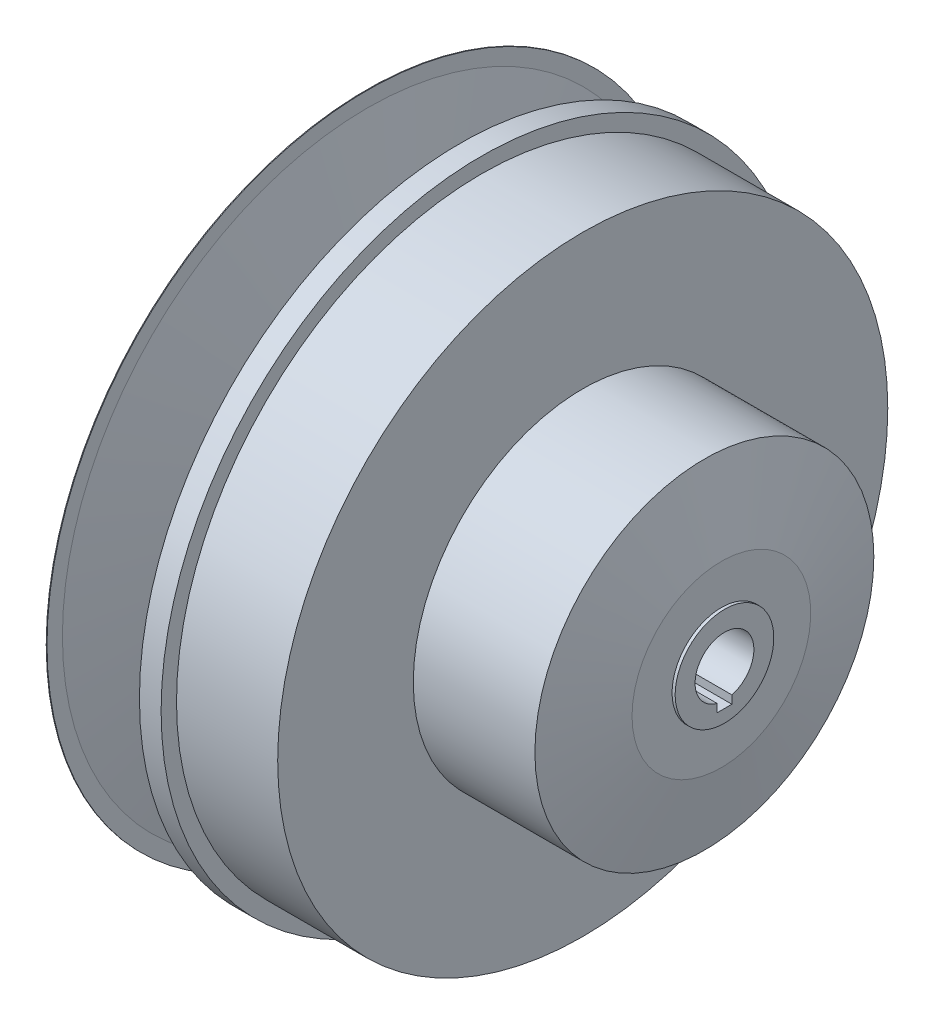
ISO-10303-21;
HEADER;
FILE_DESCRIPTION(('STEP AP214'),'2;1');
FILE_NAME('part.step','',(''),(''),'','','');
FILE_SCHEMA(('AUTOMOTIVE_DESIGN { 1 0 10303 214 1 1 1 1 }'));
ENDSEC;
DATA;
#1=APPLICATION_CONTEXT('core data for automotive mechanical design processes');
#2=APPLICATION_PROTOCOL_DEFINITION('international standard','automotive_design',2000,#1);
#3=PRODUCT_CONTEXT('',#1,'mechanical');
#4=PRODUCT('Part','Part','',(#3));
#5=PRODUCT_RELATED_PRODUCT_CATEGORY('part','',(#4));
#6=PRODUCT_DEFINITION_FORMATION('','',#4);
#7=PRODUCT_DEFINITION_CONTEXT('part definition',#1,'design');
#8=PRODUCT_DEFINITION('design','',#6,#7);
#9=PRODUCT_DEFINITION_SHAPE('','',#8);
#10=(LENGTH_UNIT() NAMED_UNIT(*) SI_UNIT(.MILLI.,.METRE.));
#11=(NAMED_UNIT(*) PLANE_ANGLE_UNIT() SI_UNIT($,.RADIAN.));
#12=(NAMED_UNIT(*) SI_UNIT($,.STERADIAN.) SOLID_ANGLE_UNIT());
#13=UNCERTAINTY_MEASURE_WITH_UNIT(LENGTH_MEASURE(1.E-05),#10,'distance_accuracy_value','');
#14=(GEOMETRIC_REPRESENTATION_CONTEXT(3) GLOBAL_UNCERTAINTY_ASSIGNED_CONTEXT((#13)) GLOBAL_UNIT_ASSIGNED_CONTEXT((#10,
#11,#12)) REPRESENTATION_CONTEXT('',''));
#15=CARTESIAN_POINT('',(0.,0.,0.));
#16=DIRECTION('',(0.,0.,1.));
#17=DIRECTION('',(1.,0.,0.));
#18=AXIS2_PLACEMENT_3D('',#15,#16,#17);
#19=CARTESIAN_POINT('',(-162.990125158944,0.,0.));
#20=DIRECTION('',(1.,0.,0.));
#21=DIRECTION('',(0.,0.,-1.));
#22=AXIS2_PLACEMENT_3D('',#19,#20,#21);
#23=PLANE('',#22);
#24=CARTESIAN_POINT('',(-162.990125158944,0.,0.));
#25=DIRECTION('',(-1.,0.,0.));
#26=DIRECTION('',(0.,0.,1.));
#27=AXIS2_PLACEMENT_3D('',#24,#25,#26);
#28=CIRCLE('',#27,15.125);
#29=CARTESIAN_POINT('',(-162.990125158944,0.,15.125));
#30=VERTEX_POINT('',#29);
#31=EDGE_CURVE('E96',#30,#30,#28,.T.);
#32=ORIENTED_EDGE('',*,*,#31,.F.);
#33=EDGE_LOOP('',(#32));
#34=FACE_BOUND('',#33,.T.);
#35=CARTESIAN_POINT('',(-162.990125158944,0.,0.));
#36=DIRECTION('',(-1.,0.,0.));
#37=DIRECTION('',(0.,0.,1.));
#38=AXIS2_PLACEMENT_3D('',#35,#36,#37);
#39=CIRCLE('',#38,16.125);
#40=CARTESIAN_POINT('',(-162.990125158944,0.,16.125));
#41=VERTEX_POINT('',#40);
#42=EDGE_CURVE('E11',#41,#41,#39,.T.);
#43=ORIENTED_EDGE('',*,*,#42,.T.);
#44=EDGE_LOOP('',(#43));
#45=FACE_BOUND('',#44,.T.);
#46=ADVANCED_FACE('F33',(#34,#45),#23,.F.);
#47=CARTESIAN_POINT('',(-162.990125158944,0.,0.));
#48=DIRECTION('',(-1.,0.,0.));
#49=DIRECTION('',(0.,0.,1.));
#50=AXIS2_PLACEMENT_3D('',#47,#48,#49);
#51=CYLINDRICAL_SURFACE('',#50,16.125);
#52=ORIENTED_EDGE('',*,*,#42,.F.);
#53=EDGE_LOOP('',(#52));
#54=FACE_BOUND('',#53,.T.);
#55=CARTESIAN_POINT('',(-163.990125158944,0.,0.));
#56=DIRECTION('',(-1.,0.,0.));
#57=DIRECTION('',(0.,0.,1.));
#58=AXIS2_PLACEMENT_3D('',#55,#56,#57);
#59=CIRCLE('',#58,16.125);
#60=CARTESIAN_POINT('',(-163.990125158944,0.,16.125));
#61=VERTEX_POINT('',#60);
#62=EDGE_CURVE('E40',#61,#61,#59,.T.);
#63=ORIENTED_EDGE('',*,*,#62,.T.);
#64=EDGE_LOOP('',(#63));
#65=FACE_BOUND('',#64,.T.);
#66=ADVANCED_FACE('F168',(#54,#65),#51,.F.);
#67=CARTESIAN_POINT('',(-163.990125158944,16.125,0.));
#68=DIRECTION('',(1.,0.,0.));
#69=DIRECTION('',(0.,0.,-1.));
#70=AXIS2_PLACEMENT_3D('',#67,#68,#69);
#71=PLANE('',#70);
#72=ORIENTED_EDGE('',*,*,#62,.F.);
#73=EDGE_LOOP('',(#72));
#74=FACE_BOUND('',#73,.T.);
#75=CARTESIAN_POINT('',(-163.990125158944,0.,0.));
#76=DIRECTION('',(-1.,0.,0.));
#77=DIRECTION('',(0.,0.,1.));
#78=AXIS2_PLACEMENT_3D('',#75,#76,#77);
#79=CIRCLE('',#78,37.7414540088167);
#80=CARTESIAN_POINT('',(-163.990125158944,0.,37.7414540088167));
#81=VERTEX_POINT('',#80);
#82=EDGE_CURVE('E163',#81,#81,#79,.T.);
#83=ORIENTED_EDGE('',*,*,#82,.T.);
#84=EDGE_LOOP('',(#83));
#85=FACE_BOUND('',#84,.T.);
#86=ADVANCED_FACE('F170',(#74,#85),#71,.F.);
#87=CARTESIAN_POINT('',(-162.990125158944,0.,0.));
#88=DIRECTION('',(-1.,0.,0.));
#89=DIRECTION('',(0.,0.,1.));
#90=AXIS2_PLACEMENT_3D('',#87,#88,#89);
#91=CYLINDRICAL_SURFACE('',#90,37.7414540088167);
#92=ORIENTED_EDGE('',*,*,#82,.F.);
#93=EDGE_LOOP('',(#92));
#94=FACE_BOUND('',#93,.T.);
#95=CARTESIAN_POINT('',(-160.123125158944,0.,0.));
#96=DIRECTION('',(-1.,0.,0.));
#97=DIRECTION('',(0.,0.,1.));
#98=AXIS2_PLACEMENT_3D('',#95,#96,#97);
#99=CIRCLE('',#98,37.7414540088167);
#100=CARTESIAN_POINT('',(-160.123125158944,0.,37.7414540088167));
#101=VERTEX_POINT('',#100);
#102=EDGE_CURVE('E160',#101,#101,#99,.T.);
#103=ORIENTED_EDGE('',*,*,#102,.T.);
#104=EDGE_LOOP('',(#103));
#105=FACE_BOUND('',#104,.T.);
#106=ADVANCED_FACE('F173',(#94,#105),#91,.T.);
#107=CARTESIAN_POINT('',(-160.123125158944,37.7414540088167,0.));
#108=DIRECTION('',(1.,0.,0.));
#109=DIRECTION('',(0.,0.,-1.));
#110=AXIS2_PLACEMENT_3D('',#107,#108,#109);
#111=PLANE('',#110);
#112=ORIENTED_EDGE('',*,*,#102,.F.);
#113=EDGE_LOOP('',(#112));
#114=FACE_BOUND('',#113,.T.);
#115=CARTESIAN_POINT('',(-160.123125158944,0.,0.));
#116=DIRECTION('',(-1.,0.,0.));
#117=DIRECTION('',(0.,0.,1.));
#118=AXIS2_PLACEMENT_3D('',#115,#116,#117);
#119=CIRCLE('',#118,99.);
#120=CARTESIAN_POINT('',(-160.123125158944,0.,99.));
#121=VERTEX_POINT('',#120);
#122=EDGE_CURVE('E157',#121,#121,#119,.T.);
#123=ORIENTED_EDGE('',*,*,#122,.T.);
#124=EDGE_LOOP('',(#123));
#125=FACE_BOUND('',#124,.T.);
#126=ADVANCED_FACE('F179',(#114,#125),#111,.F.);
#127=CARTESIAN_POINT('',(-162.990125158944,0.,0.));
#128=DIRECTION('',(-1.,0.,0.));
#129=DIRECTION('',(0.,0.,1.));
#130=AXIS2_PLACEMENT_3D('',#127,#128,#129);
#131=CYLINDRICAL_SURFACE('',#130,99.);
#132=ORIENTED_EDGE('',*,*,#122,.F.);
#133=EDGE_LOOP('',(#132));
#134=FACE_BOUND('',#133,.T.);
#135=CARTESIAN_POINT('',(-159.313606376247,0.,0.));
#136=DIRECTION('',(-1.,0.,0.));
#137=DIRECTION('',(0.,0.,1.));
#138=AXIS2_PLACEMENT_3D('',#135,#136,#137);
#139=CIRCLE('',#138,99.);
#140=CARTESIAN_POINT('',(-159.313606376247,0.,99.));
#141=VERTEX_POINT('',#140);
#142=EDGE_CURVE('E154',#141,#141,#139,.T.);
#143=ORIENTED_EDGE('',*,*,#142,.T.);
#144=EDGE_LOOP('',(#143));
#145=FACE_BOUND('',#144,.T.);
#146=ADVANCED_FACE('F185',(#134,#145),#131,.T.);
#147=CARTESIAN_POINT('',(-159.313606376247,104.,0.));
#148=DIRECTION('',(1.,0.,0.));
#149=DIRECTION('',(0.,0.,-1.));
#150=AXIS2_PLACEMENT_3D('',#147,#148,#149);
#151=PLANE('',#150);
#152=ORIENTED_EDGE('',*,*,#142,.F.);
#153=EDGE_LOOP('',(#152));
#154=FACE_BOUND('',#153,.T.);
#155=CARTESIAN_POINT('',(-159.313606376247,0.,0.));
#156=DIRECTION('',(-1.,0.,0.));
#157=DIRECTION('',(0.,0.,1.));
#158=AXIS2_PLACEMENT_3D('',#155,#156,#157);
#159=CIRCLE('',#158,104.);
#160=CARTESIAN_POINT('',(-159.313606376247,0.,104.));
#161=VERTEX_POINT('',#160);
#162=EDGE_CURVE('E151',#161,#161,#159,.T.);
#163=ORIENTED_EDGE('',*,*,#162,.T.);
#164=EDGE_LOOP('',(#163));
#165=FACE_BOUND('',#164,.T.);
#166=ADVANCED_FACE('F191',(#154,#165),#151,.F.);
#167=CARTESIAN_POINT('',(-162.990125158944,0.,0.));
#168=DIRECTION('',(-1.,0.,0.));
#169=DIRECTION('',(0.,0.,1.));
#170=AXIS2_PLACEMENT_3D('',#167,#168,#169);
#171=CYLINDRICAL_SURFACE('',#170,104.);
#172=ORIENTED_EDGE('',*,*,#162,.F.);
#173=EDGE_LOOP('',(#172));
#174=FACE_BOUND('',#173,.T.);
#175=CARTESIAN_POINT('',(-159.063606376247,0.,0.));
#176=DIRECTION('',(-1.,0.,0.));
#177=DIRECTION('',(0.,0.,1.));
#178=AXIS2_PLACEMENT_3D('',#175,#176,#177);
#179=CIRCLE('',#178,104.);
#180=CARTESIAN_POINT('',(-159.063606376247,0.,104.));
#181=VERTEX_POINT('',#180);
#182=EDGE_CURVE('E148',#181,#181,#179,.T.);
#183=ORIENTED_EDGE('',*,*,#182,.T.);
#184=EDGE_LOOP('',(#183));
#185=FACE_BOUND('',#184,.T.);
#186=ADVANCED_FACE('F197',(#174,#185),#171,.T.);
#187=CARTESIAN_POINT('',(-159.063606376247,99.,0.));
#188=DIRECTION('',(-1.,0.,0.));
#189=DIRECTION('',(0.,0.,1.));
#190=AXIS2_PLACEMENT_3D('',#187,#188,#189);
#191=PLANE('',#190);
#192=ORIENTED_EDGE('',*,*,#182,.F.);
#193=EDGE_LOOP('',(#192));
#194=FACE_BOUND('',#193,.T.);
#195=CARTESIAN_POINT('',(-159.063606376247,0.,0.));
#196=DIRECTION('',(-1.,0.,0.));
#197=DIRECTION('',(0.,0.,1.));
#198=AXIS2_PLACEMENT_3D('',#195,#196,#197);
#199=CIRCLE('',#198,99.);
#200=CARTESIAN_POINT('',(-159.063606376247,0.,99.));
#201=VERTEX_POINT('',#200);
#202=EDGE_CURVE('E145',#201,#201,#199,.T.);
#203=ORIENTED_EDGE('',*,*,#202,.T.);
#204=EDGE_LOOP('',(#203));
#205=FACE_BOUND('',#204,.T.);
#206=ADVANCED_FACE('F203',(#194,#205),#191,.F.);
#207=CARTESIAN_POINT('',(-148.352353258036,0.,0.));
#208=DIRECTION('',(-1.,0.,0.));
#209=DIRECTION('',(0.,0.,1.));
#210=AXIS2_PLACEMENT_3D('',#207,#208,#209);
#211=CONICAL_SURFACE('',#210,37.1899643021721,1.3992073118687);
#212=ORIENTED_EDGE('',*,*,#202,.F.);
#213=EDGE_LOOP('',(#212));
#214=FACE_BOUND('',#213,.T.);
#215=CARTESIAN_POINT('',(-148.352353258036,0.,0.));
#216=DIRECTION('',(-1.,0.,0.));
#217=DIRECTION('',(0.,0.,1.));
#218=AXIS2_PLACEMENT_3D('',#215,#216,#217);
#219=CIRCLE('',#218,37.1899643021721);
#220=CARTESIAN_POINT('',(-148.352353258036,0.,37.1899643021721));
#221=VERTEX_POINT('',#220);
#222=EDGE_CURVE('E142',#221,#221,#219,.T.);
#223=ORIENTED_EDGE('',*,*,#222,.T.);
#224=EDGE_LOOP('',(#223));
#225=FACE_BOUND('',#224,.T.);
#226=ADVANCED_FACE('F209',(#214,#225),#211,.T.);
#227=CARTESIAN_POINT('',(-148.352353258036,37.1899643021721,0.));
#228=DIRECTION('',(-1.,0.,0.));
#229=DIRECTION('',(0.,0.,1.));
#230=AXIS2_PLACEMENT_3D('',#227,#228,#229);
#231=PLANE('',#230);
#232=ORIENTED_EDGE('',*,*,#222,.F.);
#233=EDGE_LOOP('',(#232));
#234=FACE_BOUND('',#233,.T.);
#235=CARTESIAN_POINT('',(-148.352353258036,0.,0.));
#236=DIRECTION('',(-1.,0.,0.));
#237=DIRECTION('',(0.,0.,1.));
#238=AXIS2_PLACEMENT_3D('',#235,#236,#237);
#239=CIRCLE('',#238,29.1899643021721);
#240=CARTESIAN_POINT('',(-148.352353258036,0.,29.1899643021721));
#241=VERTEX_POINT('',#240);
#242=EDGE_CURVE('E139',#241,#241,#239,.T.);
#243=ORIENTED_EDGE('',*,*,#242,.T.);
#244=EDGE_LOOP('',(#243));
#245=FACE_BOUND('',#244,.T.);
#246=ADVANCED_FACE('F215',(#234,#245),#231,.F.);
#247=CARTESIAN_POINT('',(-162.990125158944,0.,0.));
#248=DIRECTION('',(-1.,0.,0.));
#249=DIRECTION('',(0.,0.,1.));
#250=AXIS2_PLACEMENT_3D('',#247,#248,#249);
#251=CYLINDRICAL_SURFACE('',#250,29.1899643021721);
#252=ORIENTED_EDGE('',*,*,#242,.F.);
#253=EDGE_LOOP('',(#252));
#254=FACE_BOUND('',#253,.T.);
#255=CARTESIAN_POINT('',(-145.011235330102,0.,0.));
#256=DIRECTION('',(-1.,0.,0.));
#257=DIRECTION('',(0.,0.,1.));
#258=AXIS2_PLACEMENT_3D('',#255,#256,#257);
#259=CIRCLE('',#258,29.1899643021721);
#260=CARTESIAN_POINT('',(-145.011235330102,0.,29.1899643021721));
#261=VERTEX_POINT('',#260);
#262=EDGE_CURVE('E136',#261,#261,#259,.T.);
#263=ORIENTED_EDGE('',*,*,#262,.T.);
#264=EDGE_LOOP('',(#263));
#265=FACE_BOUND('',#264,.T.);
#266=ADVANCED_FACE('F221',(#254,#265),#251,.T.);
#267=CARTESIAN_POINT('',(-145.011235330102,29.1899643021721,0.));
#268=DIRECTION('',(1.,0.,0.));
#269=DIRECTION('',(0.,0.,-1.));
#270=AXIS2_PLACEMENT_3D('',#267,#268,#269);
#271=PLANE('',#270);
#272=ORIENTED_EDGE('',*,*,#262,.F.);
#273=EDGE_LOOP('',(#272));
#274=FACE_BOUND('',#273,.T.);
#275=CARTESIAN_POINT('',(-145.011235330102,0.,0.));
#276=DIRECTION('',(-1.,0.,0.));
#277=DIRECTION('',(0.,0.,1.));
#278=AXIS2_PLACEMENT_3D('',#275,#276,#277);
#279=CIRCLE('',#278,37.1899643021721);
#280=CARTESIAN_POINT('',(-145.011235330102,0.,37.1899643021721));
#281=VERTEX_POINT('',#280);
#282=EDGE_CURVE('E133',#281,#281,#279,.T.);
#283=ORIENTED_EDGE('',*,*,#282,.T.);
#284=EDGE_LOOP('',(#283));
#285=FACE_BOUND('',#284,.T.);
#286=ADVANCED_FACE('F227',(#274,#285),#271,.F.);
#287=CARTESIAN_POINT('',(-129.063606376247,0.,0.));
#288=DIRECTION('',(1.,0.,0.));
#289=DIRECTION('',(0.,0.,-1.));
#290=AXIS2_PLACEMENT_3D('',#287,#288,#289);
#291=CONICAL_SURFACE('',#290,104.,1.33647986649083);
#292=ORIENTED_EDGE('',*,*,#282,.F.);
#293=EDGE_LOOP('',(#292));
#294=FACE_BOUND('',#293,.T.);
#295=CARTESIAN_POINT('',(-129.063606376247,0.,0.));
#296=DIRECTION('',(-1.,0.,0.));
#297=DIRECTION('',(0.,0.,1.));
#298=AXIS2_PLACEMENT_3D('',#295,#296,#297);
#299=CIRCLE('',#298,104.);
#300=CARTESIAN_POINT('',(-129.063606376247,0.,104.));
#301=VERTEX_POINT('',#300);
#302=EDGE_CURVE('E130',#301,#301,#299,.T.);
#303=ORIENTED_EDGE('',*,*,#302,.T.);
#304=EDGE_LOOP('',(#303));
#305=FACE_BOUND('',#304,.T.);
#306=ADVANCED_FACE('F233',(#294,#305),#291,.T.);
#307=CARTESIAN_POINT('',(-162.990125158944,0.,0.));
#308=DIRECTION('',(-1.,0.,0.));
#309=DIRECTION('',(0.,0.,1.));
#310=AXIS2_PLACEMENT_3D('',#307,#308,#309);
#311=CYLINDRICAL_SURFACE('',#310,104.);
#312=ORIENTED_EDGE('',*,*,#302,.F.);
#313=EDGE_LOOP('',(#312));
#314=FACE_BOUND('',#313,.T.);
#315=CARTESIAN_POINT('',(-122.028125158944,0.,0.));
#316=DIRECTION('',(-1.,0.,0.));
#317=DIRECTION('',(0.,0.,1.));
#318=AXIS2_PLACEMENT_3D('',#315,#316,#317);
#319=CIRCLE('',#318,104.);
#320=CARTESIAN_POINT('',(-122.028125158944,0.,104.));
#321=VERTEX_POINT('',#320);
#322=EDGE_CURVE('E127',#321,#321,#319,.T.);
#323=ORIENTED_EDGE('',*,*,#322,.T.);
#324=EDGE_LOOP('',(#323));
#325=FACE_BOUND('',#324,.T.);
#326=ADVANCED_FACE('F239',(#314,#325),#311,.T.);
#327=CARTESIAN_POINT('',(-122.028125158944,104.,0.));
#328=DIRECTION('',(-1.,0.,0.));
#329=DIRECTION('',(0.,0.,1.));
#330=AXIS2_PLACEMENT_3D('',#327,#328,#329);
#331=PLANE('',#330);
#332=ORIENTED_EDGE('',*,*,#322,.F.);
#333=EDGE_LOOP('',(#332));
#334=FACE_BOUND('',#333,.T.);
#335=CARTESIAN_POINT('',(-122.028125158944,0.,0.));
#336=DIRECTION('',(-1.,0.,0.));
#337=DIRECTION('',(0.,0.,1.));
#338=AXIS2_PLACEMENT_3D('',#335,#336,#337);
#339=CIRCLE('',#338,99.);
#340=CARTESIAN_POINT('',(-122.028125158944,0.,99.));
#341=VERTEX_POINT('',#340);
#342=EDGE_CURVE('E124',#341,#341,#339,.T.);
#343=ORIENTED_EDGE('',*,*,#342,.T.);
#344=EDGE_LOOP('',(#343));
#345=FACE_BOUND('',#344,.T.);
#346=ADVANCED_FACE('F245',(#334,#345),#331,.F.);
#347=CARTESIAN_POINT('',(-162.990125158944,0.,0.));
#348=DIRECTION('',(-1.,0.,0.));
#349=DIRECTION('',(0.,0.,1.));
#350=AXIS2_PLACEMENT_3D('',#347,#348,#349);
#351=CYLINDRICAL_SURFACE('',#350,99.);
#352=ORIENTED_EDGE('',*,*,#342,.F.);
#353=EDGE_LOOP('',(#352));
#354=FACE_BOUND('',#353,.T.);
#355=CARTESIAN_POINT('',(-89.1901251589438,0.,0.));
#356=DIRECTION('',(-1.,0.,0.));
#357=DIRECTION('',(0.,0.,1.));
#358=AXIS2_PLACEMENT_3D('',#355,#356,#357);
#359=CIRCLE('',#358,99.);
#360=CARTESIAN_POINT('',(-89.1901251589438,0.,99.));
#361=VERTEX_POINT('',#360);
#362=EDGE_CURVE('E121',#361,#361,#359,.T.);
#363=ORIENTED_EDGE('',*,*,#362,.T.);
#364=EDGE_LOOP('',(#363));
#365=FACE_BOUND('',#364,.T.);
#366=ADVANCED_FACE('F251',(#354,#365),#351,.T.);
#367=CARTESIAN_POINT('',(-89.1901251589438,99.,0.));
#368=DIRECTION('',(-1.,0.,0.));
#369=DIRECTION('',(0.,0.,1.));
#370=AXIS2_PLACEMENT_3D('',#367,#368,#369);
#371=PLANE('',#370);
#372=ORIENTED_EDGE('',*,*,#362,.F.);
#373=EDGE_LOOP('',(#372));
#374=FACE_BOUND('',#373,.T.);
#375=CARTESIAN_POINT('',(-89.1901251589438,0.,0.));
#376=DIRECTION('',(-1.,0.,0.));
#377=DIRECTION('',(0.,0.,1.));
#378=AXIS2_PLACEMENT_3D('',#375,#376,#377);
#379=CIRCLE('',#378,55.);
#380=CARTESIAN_POINT('',(-89.1901251589438,0.,55.));
#381=VERTEX_POINT('',#380);
#382=EDGE_CURVE('E118',#381,#381,#379,.T.);
#383=ORIENTED_EDGE('',*,*,#382,.T.);
#384=EDGE_LOOP('',(#383));
#385=FACE_BOUND('',#384,.T.);
#386=ADVANCED_FACE('F257',(#374,#385),#371,.F.);
#387=CARTESIAN_POINT('',(-162.990125158944,0.,0.));
#388=DIRECTION('',(-1.,0.,0.));
#389=DIRECTION('',(0.,0.,1.));
#390=AXIS2_PLACEMENT_3D('',#387,#388,#389);
#391=CYLINDRICAL_SURFACE('',#390,55.);
#392=ORIENTED_EDGE('',*,*,#382,.F.);
#393=EDGE_LOOP('',(#392));
#394=FACE_BOUND('',#393,.T.);
#395=CARTESIAN_POINT('',(-49.7165957623644,0.,0.));
#396=DIRECTION('',(-1.,0.,0.));
#397=DIRECTION('',(0.,0.,1.));
#398=AXIS2_PLACEMENT_3D('',#395,#396,#397);
#399=CIRCLE('',#398,55.);
#400=CARTESIAN_POINT('',(-49.7165957623644,0.,55.));
#401=VERTEX_POINT('',#400);
#402=EDGE_CURVE('E115',#401,#401,#399,.T.);
#403=ORIENTED_EDGE('',*,*,#402,.T.);
#404=EDGE_LOOP('',(#403));
#405=FACE_BOUND('',#404,.T.);
#406=ADVANCED_FACE('F263',(#394,#405),#391,.T.);
#407=CARTESIAN_POINT('',(-44.1901251589438,0.,0.));
#408=DIRECTION('',(-1.,0.,0.));
#409=DIRECTION('',(0.,0.,1.));
#410=AXIS2_PLACEMENT_3D('',#407,#408,#409);
#411=CONICAL_SURFACE('',#410,29.,1.36135681655558);
#412=ORIENTED_EDGE('',*,*,#402,.F.);
#413=EDGE_LOOP('',(#412));
#414=FACE_BOUND('',#413,.T.);
#415=CARTESIAN_POINT('',(-44.1901251589438,0.,0.));
#416=DIRECTION('',(-1.,0.,0.));
#417=DIRECTION('',(0.,0.,1.));
#418=AXIS2_PLACEMENT_3D('',#415,#416,#417);
#419=CIRCLE('',#418,29.);
#420=CARTESIAN_POINT('',(-44.1901251589438,0.,29.));
#421=VERTEX_POINT('',#420);
#422=EDGE_CURVE('E112',#421,#421,#419,.T.);
#423=ORIENTED_EDGE('',*,*,#422,.T.);
#424=EDGE_LOOP('',(#423));
#425=FACE_BOUND('',#424,.T.);
#426=ADVANCED_FACE('F269',(#414,#425),#411,.T.);
#427=CARTESIAN_POINT('',(-44.1901251589438,29.,0.));
#428=DIRECTION('',(-1.,0.,0.));
#429=DIRECTION('',(0.,0.,1.));
#430=AXIS2_PLACEMENT_3D('',#427,#428,#429);
#431=PLANE('',#430);
#432=ORIENTED_EDGE('',*,*,#422,.F.);
#433=EDGE_LOOP('',(#432));
#434=FACE_BOUND('',#433,.T.);
#435=CARTESIAN_POINT('',(-44.1901251589438,0.,0.));
#436=DIRECTION('',(-1.,0.,0.));
#437=DIRECTION('',(0.,0.,1.));
#438=AXIS2_PLACEMENT_3D('',#435,#436,#437);
#439=CIRCLE('',#438,16.0151956520382);
#440=CARTESIAN_POINT('',(-44.1901251589438,0.,16.0151956520382));
#441=VERTEX_POINT('',#440);
#442=EDGE_CURVE('E109',#441,#441,#439,.T.);
#443=ORIENTED_EDGE('',*,*,#442,.T.);
#444=EDGE_LOOP('',(#443));
#445=FACE_BOUND('',#444,.T.);
#446=ADVANCED_FACE('F275',(#434,#445),#431,.F.);
#447=CARTESIAN_POINT('',(-162.990125158944,0.,0.));
#448=DIRECTION('',(-1.,0.,0.));
#449=DIRECTION('',(0.,0.,1.));
#450=AXIS2_PLACEMENT_3D('',#447,#448,#449);
#451=CYLINDRICAL_SURFACE('',#450,16.0151956520382);
#452=ORIENTED_EDGE('',*,*,#442,.F.);
#453=EDGE_LOOP('',(#452));
#454=FACE_BOUND('',#453,.T.);
#455=CARTESIAN_POINT('',(-43.1901251589439,0.,0.));
#456=DIRECTION('',(-1.,0.,0.));
#457=DIRECTION('',(0.,0.,1.));
#458=AXIS2_PLACEMENT_3D('',#455,#456,#457);
#459=CIRCLE('',#458,16.0151956520382);
#460=CARTESIAN_POINT('',(-43.1901251589439,0.,16.0151956520382));
#461=VERTEX_POINT('',#460);
#462=EDGE_CURVE('E105',#461,#461,#459,.T.);
#463=ORIENTED_EDGE('',*,*,#462,.T.);
#464=EDGE_LOOP('',(#463));
#465=FACE_BOUND('',#464,.T.);
#466=ADVANCED_FACE('F281',(#454,#465),#451,.T.);
#467=CARTESIAN_POINT('',(-43.1901251589438,16.0151956520382,0.));
#468=DIRECTION('',(-1.,0.,0.));
#469=DIRECTION('',(0.,0.,1.));
#470=AXIS2_PLACEMENT_3D('',#467,#468,#469);
#471=PLANE('',#470);
#472=CARTESIAN_POINT('',(-43.1901251589438,0.,0.));
#473=DIRECTION('',(-1.,0.,0.));
#474=DIRECTION('',(0.,0.,1.));
#475=AXIS2_PLACEMENT_3D('',#472,#473,#474);
#476=CIRCLE('',#475,9.543);
#477=CARTESIAN_POINT('',(-43.1901251589438,-9.23627895854169,-2.4));
#478=VERTEX_POINT('',#477);
#479=CARTESIAN_POINT('',(-43.1901251589438,-9.23627895854169,2.4));
#480=VERTEX_POINT('',#479);
#481=EDGE_CURVE('E86',#478,#480,#476,.F.);
#482=ORIENTED_EDGE('',*,*,#481,.F.);
#483=DIRECTION('',(0.,1.,0.));
#484=VECTOR('',#483,1.);
#485=CARTESIAN_POINT('',(-43.1901251589438,-7.219,-2.4));
#486=LINE('',#485,#484);
#487=CARTESIAN_POINT('',(-43.1901251589438,-11.867,-2.4));
#488=VERTEX_POINT('',#487);
#489=EDGE_CURVE('E72',#488,#478,#486,.T.);
#490=ORIENTED_EDGE('',*,*,#489,.F.);
#491=DIRECTION('',(0.,0.,-1.));
#492=VECTOR('',#491,1.);
#493=CARTESIAN_POINT('',(-43.1901251589438,-11.867,2.4));
#494=LINE('',#493,#492);
#495=CARTESIAN_POINT('',(-43.1901251589438,-11.867,2.4));
#496=VERTEX_POINT('',#495);
#497=EDGE_CURVE('E458',#496,#488,#494,.T.);
#498=ORIENTED_EDGE('',*,*,#497,.F.);
#499=DIRECTION('',(0.,-1.,0.));
#500=VECTOR('',#499,1.);
#501=CARTESIAN_POINT('',(-43.1901251589438,-7.219,2.4));
#502=LINE('',#501,#500);
#503=EDGE_CURVE('E79',#480,#496,#502,.T.);
#504=ORIENTED_EDGE('',*,*,#503,.F.);
#505=EDGE_LOOP('',(#482,#490,#498,#504));
#506=FACE_BOUND('',#505,.T.);
#507=ORIENTED_EDGE('',*,*,#462,.F.);
#508=EDGE_LOOP('',(#507));
#509=FACE_BOUND('',#508,.T.);
#510=ADVANCED_FACE('F93',(#506,#509),#471,.F.);
#511=CARTESIAN_POINT('',(-138.590125158944,0.,0.));
#512=DIRECTION('',(-1.,0.,0.));
#513=DIRECTION('',(0.,0.,1.));
#514=AXIS2_PLACEMENT_3D('',#511,#512,#513);
#515=CYLINDRICAL_SURFACE('',#514,15.125);
#516=CARTESIAN_POINT('',(-138.590125158944,0.,0.));
#517=DIRECTION('',(-1.,0.,0.));
#518=DIRECTION('',(0.,0.,1.));
#519=AXIS2_PLACEMENT_3D('',#516,#517,#518);
#520=CIRCLE('',#519,15.125);
#521=CARTESIAN_POINT('',(-138.590125158944,0.,15.125));
#522=VERTEX_POINT('',#521);
#523=EDGE_CURVE('E99',#522,#522,#520,.T.);
#524=ORIENTED_EDGE('',*,*,#523,.F.);
#525=EDGE_LOOP('',(#524));
#526=FACE_BOUND('',#525,.T.);
#527=ORIENTED_EDGE('',*,*,#31,.T.);
#528=EDGE_LOOP('',(#527));
#529=FACE_BOUND('',#528,.T.);
#530=ADVANCED_FACE('F290',(#526,#529),#515,.F.);
#531=CARTESIAN_POINT('',(-138.590125158944,0.,0.));
#532=DIRECTION('',(-1.,0.,0.));
#533=DIRECTION('',(0.,0.,1.));
#534=AXIS2_PLACEMENT_3D('',#531,#532,#533);
#535=PLANE('',#534);
#536=DIRECTION('',(0.,1.,0.));
#537=VECTOR('',#536,1.);
#538=CARTESIAN_POINT('',(-138.590125158944,-7.219,-2.4));
#539=LINE('',#538,#537);
#540=CARTESIAN_POINT('',(-138.590125158944,-11.867,-2.4));
#541=VERTEX_POINT('',#540);
#542=CARTESIAN_POINT('',(-138.590125158944,-9.23627895854169,-2.4));
#543=VERTEX_POINT('',#542);
#544=EDGE_CURVE('E80',#541,#543,#539,.T.);
#545=ORIENTED_EDGE('',*,*,#544,.T.);
#546=CARTESIAN_POINT('',(-138.590125158944,0.,0.));
#547=DIRECTION('',(-1.,0.,0.));
#548=DIRECTION('',(0.,0.,1.));
#549=AXIS2_PLACEMENT_3D('',#546,#547,#548);
#550=CIRCLE('',#549,9.543);
#551=CARTESIAN_POINT('',(-138.590125158944,-9.23627895854169,2.4));
#552=VERTEX_POINT('',#551);
#553=EDGE_CURVE('E88',#552,#543,#550,.T.);
#554=ORIENTED_EDGE('',*,*,#553,.F.);
#555=DIRECTION('',(0.,-1.,0.));
#556=VECTOR('',#555,1.);
#557=CARTESIAN_POINT('',(-138.590125158944,-7.219,2.4));
#558=LINE('',#557,#556);
#559=CARTESIAN_POINT('',(-138.590125158944,-11.867,2.4));
#560=VERTEX_POINT('',#559);
#561=EDGE_CURVE('E47',#552,#560,#558,.T.);
#562=ORIENTED_EDGE('',*,*,#561,.T.);
#563=DIRECTION('',(0.,0.,-1.));
#564=VECTOR('',#563,1.);
#565=CARTESIAN_POINT('',(-138.590125158944,-11.867,2.4));
#566=LINE('',#565,#564);
#567=EDGE_CURVE('E89',#560,#541,#566,.T.);
#568=ORIENTED_EDGE('',*,*,#567,.T.);
#569=EDGE_LOOP('',(#545,#554,#562,#568));
#570=FACE_BOUND('',#569,.T.);
#571=ORIENTED_EDGE('',*,*,#523,.T.);
#572=EDGE_LOOP('',(#571));
#573=FACE_BOUND('',#572,.T.);
#574=ADVANCED_FACE('F295',(#570,#573),#535,.T.);
#575=CARTESIAN_POINT('',(-43.1891251589439,0.,0.));
#576=DIRECTION('',(-1.,0.,0.));
#577=DIRECTION('',(0.,0.,1.));
#578=AXIS2_PLACEMENT_3D('',#575,#576,#577);
#579=CYLINDRICAL_SURFACE('',#578,9.543);
#580=ORIENTED_EDGE('',*,*,#553,.T.);
#581=DIRECTION('',(-1.,0.,0.));
#582=VECTOR('',#581,1.);
#583=CARTESIAN_POINT('',(-43.1891251589439,-9.23627895854169,-2.4));
#584=LINE('',#583,#582);
#585=EDGE_CURVE('E55',#478,#543,#584,.T.);
#586=ORIENTED_EDGE('',*,*,#585,.F.);
#587=ORIENTED_EDGE('',*,*,#481,.T.);
#588=DIRECTION('',(-1.,0.,0.));
#589=VECTOR('',#588,1.);
#590=CARTESIAN_POINT('',(-43.1891251589439,-9.23627895854169,2.4));
#591=LINE('',#590,#589);
#592=EDGE_CURVE('E90',#552,#480,#591,.F.);
#593=ORIENTED_EDGE('',*,*,#592,.F.);
#594=EDGE_LOOP('',(#580,#586,#587,#593));
#595=FACE_BOUND('',#594,.T.);
#596=ADVANCED_FACE('F85',(#595),#579,.F.);
#597=CARTESIAN_POINT('',(-163.991125158944,-7.219,-2.4));
#598=DIRECTION('',(0.,0.,-1.));
#599=DIRECTION('',(0.,1.,0.));
#600=AXIS2_PLACEMENT_3D('',#597,#598,#599);
#601=PLANE('',#600);
#602=DIRECTION('',(1.,0.,0.));
#603=VECTOR('',#602,1.);
#604=CARTESIAN_POINT('',(-163.991125158944,-11.867,-2.4));
#605=LINE('',#604,#603);
#606=EDGE_CURVE('E74',#541,#488,#605,.T.);
#607=ORIENTED_EDGE('',*,*,#606,.T.);
#608=ORIENTED_EDGE('',*,*,#489,.T.);
#609=ORIENTED_EDGE('',*,*,#585,.T.);
#610=ORIENTED_EDGE('',*,*,#544,.F.);
#611=EDGE_LOOP('',(#607,#608,#609,#610));
#612=FACE_BOUND('',#611,.T.);
#613=ADVANCED_FACE('F73',(#612),#601,.F.);
#614=CARTESIAN_POINT('',(-163.991125158944,-11.867,2.4));
#615=DIRECTION('',(0.,-1.,0.));
#616=DIRECTION('',(0.,0.,-1.));
#617=AXIS2_PLACEMENT_3D('',#614,#615,#616);
#618=PLANE('',#617);
#619=DIRECTION('',(1.,0.,0.));
#620=VECTOR('',#619,1.);
#621=CARTESIAN_POINT('',(-163.991125158944,-11.867,2.4));
#622=LINE('',#621,#620);
#623=EDGE_CURVE('E460',#560,#496,#622,.T.);
#624=ORIENTED_EDGE('',*,*,#623,.T.);
#625=ORIENTED_EDGE('',*,*,#497,.T.);
#626=ORIENTED_EDGE('',*,*,#606,.F.);
#627=ORIENTED_EDGE('',*,*,#567,.F.);
#628=EDGE_LOOP('',(#624,#625,#626,#627));
#629=FACE_BOUND('',#628,.T.);
#630=ADVANCED_FACE('F430',(#629),#618,.F.);
#631=CARTESIAN_POINT('',(-163.991125158944,-7.219,2.4));
#632=DIRECTION('',(0.,0.,1.));
#633=DIRECTION('',(0.,-1.,0.));
#634=AXIS2_PLACEMENT_3D('',#631,#632,#633);
#635=PLANE('',#634);
#636=ORIENTED_EDGE('',*,*,#592,.T.);
#637=ORIENTED_EDGE('',*,*,#503,.T.);
#638=ORIENTED_EDGE('',*,*,#623,.F.);
#639=ORIENTED_EDGE('',*,*,#561,.F.);
#640=EDGE_LOOP('',(#636,#637,#638,#639));
#641=FACE_BOUND('',#640,.T.);
#642=ADVANCED_FACE('F439',(#641),#635,.F.);
#643=CLOSED_SHELL('',(#46,#66,#86,#106,#126,#146,#166,#186,#206,#226,#246,#266,#286,#306,#326,
#346,#366,#386,#406,#426,#446,#466,#510,#530,#574,#596,#613,#630,#642));
#644=MANIFOLD_SOLID_BREP('B2',#643);
#645=ADVANCED_BREP_SHAPE_REPRESENTATION('',(#18,#644),#14);
#646=SHAPE_DEFINITION_REPRESENTATION(#9,#645);
ENDSEC;
END-ISO-10303-21;
